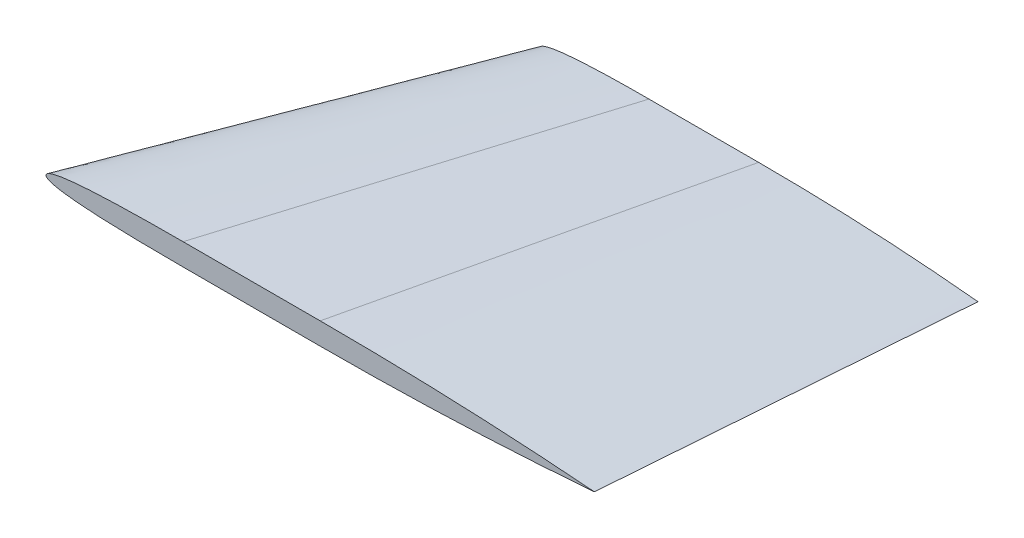
ISO-10303-21;
HEADER;
FILE_DESCRIPTION(('STEP AP214'),'2;1');
FILE_NAME('part.step','',(''),(''),'','','');
FILE_SCHEMA(('AUTOMOTIVE_DESIGN { 1 0 10303 214 1 1 1 1 }'));
ENDSEC;
DATA;
#1=APPLICATION_CONTEXT('core data for automotive mechanical design processes');
#2=APPLICATION_PROTOCOL_DEFINITION('international standard','automotive_design',2000,#1);
#3=PRODUCT_CONTEXT('',#1,'mechanical');
#4=PRODUCT('Part','Part','',(#3));
#5=PRODUCT_RELATED_PRODUCT_CATEGORY('part','',(#4));
#6=PRODUCT_DEFINITION_FORMATION('','',#4);
#7=PRODUCT_DEFINITION_CONTEXT('part definition',#1,'design');
#8=PRODUCT_DEFINITION('design','',#6,#7);
#9=PRODUCT_DEFINITION_SHAPE('','',#8);
#10=(LENGTH_UNIT() NAMED_UNIT(*) SI_UNIT(.MILLI.,.METRE.));
#11=(NAMED_UNIT(*) PLANE_ANGLE_UNIT() SI_UNIT($,.RADIAN.));
#12=(NAMED_UNIT(*) SI_UNIT($,.STERADIAN.) SOLID_ANGLE_UNIT());
#13=UNCERTAINTY_MEASURE_WITH_UNIT(LENGTH_MEASURE(1.E-05),#10,'distance_accuracy_value','');
#14=(GEOMETRIC_REPRESENTATION_CONTEXT(3) GLOBAL_UNCERTAINTY_ASSIGNED_CONTEXT((#13)) GLOBAL_UNIT_ASSIGNED_CONTEXT((#10,
#11,#12)) REPRESENTATION_CONTEXT('',''));
#15=CARTESIAN_POINT('',(0.,0.,0.));
#16=DIRECTION('',(0.,0.,1.));
#17=DIRECTION('',(1.,0.,0.));
#18=AXIS2_PLACEMENT_3D('',#15,#16,#17);
#19=CARTESIAN_POINT('',(0.,0.,0.));
#20=DIRECTION('',(0.,-1.,0.));
#21=DIRECTION('',(0.,0.,-1.));
#22=AXIS2_PLACEMENT_3D('',#19,#20,#21);
#23=PLANE('',#22);
#24=DIRECTION('',(-1.,0.,0.));
#25=VECTOR('',#24,1.);
#26=CARTESIAN_POINT('',(-33.3550389878657,0.,-28.8888888888889));
#27=LINE('',#26,#25);
#28=CARTESIAN_POINT('',(6.64496101213429,0.,-28.8888888888889));
#29=VERTEX_POINT('',#28);
#30=CARTESIAN_POINT('',(-13.3550389878657,0.,-28.8888888888889));
#31=VERTEX_POINT('',#30);
#32=EDGE_CURVE('E158',#29,#31,#27,.T.);
#33=ORIENTED_EDGE('',*,*,#32,.F.);
#34=DIRECTION('',(0.224164243499484,0.,-0.974551379833975));
#35=VECTOR('',#34,1.);
#36=CARTESIAN_POINT('',(-8.30620126516782,0.,36.1111111111111));
#37=LINE('',#36,#35);
#38=CARTESIAN_POINT('',(-8.30620126516782,0.,36.1111111111111));
#39=VERTEX_POINT('',#38);
#40=EDGE_CURVE('E236',#39,#29,#37,.T.);
#41=ORIENTED_EDGE('',*,*,#40,.F.);
#42=DIRECTION('',(1.,0.,0.));
#43=VECTOR('',#42,1.);
#44=CARTESIAN_POINT('',(-58.3062012651678,0.,36.1111111111111));
#45=LINE('',#44,#43);
#46=CARTESIAN_POINT('',(-33.3062012651678,0.,36.1111111111111));
#47=VERTEX_POINT('',#46);
#48=EDGE_CURVE('E213',#47,#39,#45,.T.);
#49=ORIENTED_EDGE('',*,*,#48,.F.);
#50=DIRECTION('',(0.293429624995853,0.,-0.955980677197397));
#51=VECTOR('',#50,1.);
#52=CARTESIAN_POINT('',(-23.3306201265168,0.,3.61111111111109));
#53=LINE('',#52,#51);
#54=EDGE_CURVE('E275',#47,#31,#53,.T.);
#55=ORIENTED_EDGE('',*,*,#54,.T.);
#56=EDGE_LOOP('',(#33,#41,#49,#55));
#57=FACE_BOUND('',#56,.T.);
#58=ADVANCED_FACE('F130',(#57),#23,.T.);
#59=CARTESIAN_POINT('',(0.,4.,0.));
#60=DIRECTION('',(0.,-1.,0.));
#61=DIRECTION('',(0.,0.,-1.));
#62=AXIS2_PLACEMENT_3D('',#59,#60,#61);
#63=PLANE('',#62);
#64=DIRECTION('',(1.,0.,0.));
#65=VECTOR('',#64,1.);
#66=CARTESIAN_POINT('',(-58.3062012651678,4.,36.1111111111111));
#67=LINE('',#66,#65);
#68=CARTESIAN_POINT('',(-33.3062012651678,4.,36.1111111111111));
#69=VERTEX_POINT('',#68);
#70=CARTESIAN_POINT('',(-8.30620126516782,4.,36.1111111111111));
#71=VERTEX_POINT('',#70);
#72=EDGE_CURVE('E142',#69,#71,#67,.T.);
#73=ORIENTED_EDGE('',*,*,#72,.T.);
#74=DIRECTION('',(0.224164243499484,0.,-0.974551379833975));
#75=VECTOR('',#74,1.);
#76=CARTESIAN_POINT('',(-0.830620126516762,4.,3.61111111111109));
#77=LINE('',#76,#75);
#78=CARTESIAN_POINT('',(6.64496101213429,4.,-28.8888888888889));
#79=VERTEX_POINT('',#78);
#80=EDGE_CURVE('E191',#71,#79,#77,.T.);
#81=ORIENTED_EDGE('',*,*,#80,.T.);
#82=DIRECTION('',(-1.,0.,0.));
#83=VECTOR('',#82,1.);
#84=CARTESIAN_POINT('',(-33.3550389878657,4.,-28.8888888888889));
#85=LINE('',#84,#83);
#86=CARTESIAN_POINT('',(-13.3550389878657,4.,-28.8888888888889));
#87=VERTEX_POINT('',#86);
#88=EDGE_CURVE('E211',#79,#87,#85,.T.);
#89=ORIENTED_EDGE('',*,*,#88,.T.);
#90=CARTESIAN_POINT('',(-33.3062012651678,4.,36.1111111111111));
#91=CARTESIAN_POINT('',(-26.6558138394004,4.,14.4444444444444));
#92=CARTESIAN_POINT('',(-20.0054264136331,4.,-7.22222222222225));
#93=CARTESIAN_POINT('',(-13.3550389878657,4.,-28.8888888888889));
#94=B_SPLINE_CURVE_WITH_KNOTS('',3,(#90,#91,#92,#93),.UNSPECIFIED.,.F.,.F.,(4,4),(0.,1.),.UNSPECIFIED.);
#95=EDGE_CURVE('E210',#69,#87,#94,.T.);
#96=ORIENTED_EDGE('',*,*,#95,.F.);
#97=EDGE_LOOP('',(#73,#81,#89,#96));
#98=FACE_BOUND('',#97,.T.);
#99=ADVANCED_FACE('F208',(#98),#63,.F.);
#100=CARTESIAN_POINT('',(-33.3550389878657,4.,-28.8888888888889));
#101=DIRECTION('',(0.,0.,1.));
#102=DIRECTION('',(1.,0.,0.));
#103=AXIS2_PLACEMENT_3D('',#100,#101,#102);
#104=PLANE('',#103);
#105=ORIENTED_EDGE('',*,*,#88,.F.);
#106=CARTESIAN_POINT('',(6.64496101213429,4.,-28.8888888888889));
#107=CARTESIAN_POINT('',(26.7075815989268,3.99999999999999,-28.8888888888889));
#108=CARTESIAN_POINT('',(46.6449610121343,2.,-28.8888888888889));
#109=B_SPLINE_CURVE_WITH_KNOTS('',2,(#106,#107,#108),.UNSPECIFIED.,.F.,.F.,(3,3),(0.,1.),.UNSPECIFIED.);
#110=CARTESIAN_POINT('',(46.6449610121343,2.,-28.8888888888889));
#111=VERTEX_POINT('',#110);
#112=EDGE_CURVE('E194',#79,#111,#109,.T.);
#113=ORIENTED_EDGE('',*,*,#112,.T.);
#114=CARTESIAN_POINT('',(6.64496101213429,0.,-28.8888888888889));
#115=CARTESIAN_POINT('',(26.7075815989268,0.,-28.8888888888889));
#116=CARTESIAN_POINT('',(46.6449610121343,2.,-28.8888888888889));
#117=B_SPLINE_CURVE_WITH_KNOTS('',2,(#114,#115,#116),.UNSPECIFIED.,.F.,.F.,(3,3),(0.,1.),.UNSPECIFIED.);
#118=EDGE_CURVE('E241',#29,#111,#117,.T.);
#119=ORIENTED_EDGE('',*,*,#118,.F.);
#120=ORIENTED_EDGE('',*,*,#32,.T.);
#121=CARTESIAN_POINT('',(-33.3550389878657,2.,-28.8888888888889));
#122=CARTESIAN_POINT('',(-33.4768817300547,-0.000156597654709864,-28.8888888888889));
#123=CARTESIAN_POINT('',(-13.3550389878657,0.,-28.8888888888889));
#124=B_SPLINE_CURVE_WITH_KNOTS('',2,(#121,#122,#123),.UNSPECIFIED.,.F.,.F.,(3,3),(0.,1.),.UNSPECIFIED.);
#125=CARTESIAN_POINT('',(-33.3550389878657,1.95213566414585,-28.8888888888889));
#126=VERTEX_POINT('',#125);
#127=EDGE_CURVE('E232',#126,#31,#124,.T.);
#128=ORIENTED_EDGE('',*,*,#127,.F.);
#129=DIRECTION('',(0.,-1.,0.));
#130=VECTOR('',#129,1.);
#131=CARTESIAN_POINT('',(-33.3550389878657,4.,-28.8888888888889));
#132=LINE('',#131,#130);
#133=CARTESIAN_POINT('',(-33.3550389878657,2.04786433585425,-28.8888888888889));
#134=VERTEX_POINT('',#133);
#135=EDGE_CURVE('E13',#134,#126,#132,.T.);
#136=ORIENTED_EDGE('',*,*,#135,.F.);
#137=CARTESIAN_POINT('',(-33.3550389878657,2.,-28.8888888888889));
#138=CARTESIAN_POINT('',(-33.4768817300547,4.00015659765471,-28.8888888888889));
#139=CARTESIAN_POINT('',(-13.3550389878657,4.,-28.8888888888889));
#140=B_SPLINE_CURVE_WITH_KNOTS('',2,(#137,#138,#139),.UNSPECIFIED.,.F.,.F.,(3,3),(0.,1.),.UNSPECIFIED.);
#141=EDGE_CURVE('E231',#134,#87,#140,.T.);
#142=ORIENTED_EDGE('',*,*,#141,.T.);
#143=EDGE_LOOP('',(#105,#113,#119,#120,#128,#136,#142));
#144=FACE_BOUND('',#143,.T.);
#145=ADVANCED_FACE('F132',(#144),#104,.F.);
#146=CARTESIAN_POINT('',(-58.3062012651678,4.,36.1111111111111));
#147=DIRECTION('',(0.933580426497201,0.,0.358367949545301));
#148=DIRECTION('',(0.358367949545301,0.,-0.933580426497201));
#149=AXIS2_PLACEMENT_3D('',#146,#147,#148);
#150=PLANE('',#149);
#151=ORIENTED_EDGE('',*,*,#135,.T.);
#152=DIRECTION('',(0.358367864861597,-0.000687464561868342,-0.933580205888608));
#153=VECTOR('',#152,1.);
#154=CARTESIAN_POINT('',(-58.3062012651678,2.,36.1111111111111));
#155=LINE('',#154,#153);
#156=CARTESIAN_POINT('',(-58.3057212466994,2.00600220058824,36.1111111111111));
#157=VERTEX_POINT('',#156);
#158=EDGE_CURVE('E278',#157,#126,#155,.T.);
#159=ORIENTED_EDGE('',*,*,#158,.F.);
#160=CARTESIAN_POINT('',(-58.3062012651678,2.,36.1111111111111));
#161=CARTESIAN_POINT('',(-49.9891471727338,2.01595477861808,14.4444444444444));
#162=CARTESIAN_POINT('',(-41.6720930802997,2.03190955723617,-7.22222222222225));
#163=CARTESIAN_POINT('',(-33.3550389878657,2.04786433585425,-28.8888888888889));
#164=B_SPLINE_CURVE_WITH_KNOTS('',3,(#160,#161,#162,#163),.UNSPECIFIED.,.F.,.F.,(4,4),(0.,1.),.UNSPECIFIED.);
#165=EDGE_CURVE('E380',#157,#134,#164,.T.);
#166=ORIENTED_EDGE('',*,*,#165,.T.);
#167=EDGE_LOOP('',(#151,#159,#166));
#168=FACE_BOUND('',#167,.T.);
#169=ADVANCED_FACE('F361',(#168),#150,.F.);
#170=CARTESIAN_POINT('',(-58.3062012651678,4.,36.1111111111111));
#171=DIRECTION('',(0.,0.,-1.));
#172=DIRECTION('',(-1.,0.,0.));
#173=AXIS2_PLACEMENT_3D('',#170,#171,#172);
#174=PLANE('',#173);
#175=CARTESIAN_POINT('',(-8.30620126516782,0.,36.1111111111111));
#176=CARTESIAN_POINT('',(16.7498473667231,0.,36.1111111111111));
#177=CARTESIAN_POINT('',(41.6937987348322,2.,36.1111111111111));
#178=B_SPLINE_CURVE_WITH_KNOTS('',2,(#175,#176,#177),.UNSPECIFIED.,.F.,.F.,(3,3),(0.,1.),.UNSPECIFIED.);
#179=CARTESIAN_POINT('',(41.6937987348322,2.,36.1111111111111));
#180=VERTEX_POINT('',#179);
#181=EDGE_CURVE('E205',#39,#180,#178,.T.);
#182=ORIENTED_EDGE('',*,*,#181,.T.);
#183=CARTESIAN_POINT('',(-8.30620126516782,4.,36.1111111111111));
#184=CARTESIAN_POINT('',(16.749847366723,4.,36.1111111111111));
#185=CARTESIAN_POINT('',(41.6937987348322,2.,36.1111111111111));
#186=B_SPLINE_CURVE_WITH_KNOTS('',2,(#183,#184,#185),.UNSPECIFIED.,.F.,.F.,(3,3),(0.,1.),.UNSPECIFIED.);
#187=EDGE_CURVE('E150',#71,#180,#186,.T.);
#188=ORIENTED_EDGE('',*,*,#187,.F.);
#189=ORIENTED_EDGE('',*,*,#72,.F.);
#190=CARTESIAN_POINT('',(-58.3062012651678,2.,36.1111111111111));
#191=CARTESIAN_POINT('',(-58.2981682863197,2.13185803387447,36.1111111111111));
#192=CARTESIAN_POINT('',(-58.1165495380854,2.3512782454784,36.1111111111111));
#193=CARTESIAN_POINT('',(-57.6523540562812,2.59937777239834,36.1111111111111));
#194=CARTESIAN_POINT('',(-57.0197515682006,2.80617439716223,36.111111111111));
#195=CARTESIAN_POINT('',(-56.3769150244662,2.95010416964718,36.1111111111111));
#196=CARTESIAN_POINT('',(-55.8568799760318,3.04843051159478,36.1111111111111));
#197=CARTESIAN_POINT('',(-55.3359662965872,3.13504754543367,36.1111111111111));
#198=CARTESIAN_POINT('',(-54.6818489795878,3.2286430482675,36.1111111111111));
#199=CARTESIAN_POINT('',(-53.6326085869534,3.35434667278868,36.111111111111));
#200=CARTESIAN_POINT('',(-52.3173026060738,3.47915567883608,36.1111111111111));
#201=CARTESIAN_POINT('',(-50.736341932929,3.59550791665806,36.1111111111111));
#202=CARTESIAN_POINT('',(-49.1537633268491,3.68800069592947,36.1111111111111));
#203=CARTESIAN_POINT('',(-47.5702823950901,3.76243746410943,36.1111111111111));
#204=CARTESIAN_POINT('',(-45.9861816087334,3.82258876530267,36.1111111111111));
#205=CARTESIAN_POINT('',(-44.4016961914234,3.87109571460881,36.111111111111));
#206=CARTESIAN_POINT('',(-42.8169399486991,3.90986090614081,36.1111111111111));
#207=CARTESIAN_POINT('',(-41.2320059940613,3.94034760640304,36.1111111111111));
#208=CARTESIAN_POINT('',(-39.1186009927976,3.97140917344184,36.1111111111111));
#209=CARTESIAN_POINT('',(-36.4766432024574,3.99460959973483,36.1111111111111));
#210=CARTESIAN_POINT('',(-34.3630212451883,4.,36.1111111111111));
#211=CARTESIAN_POINT('',(-33.3062012651678,4.,36.1111111111111));
#212=B_SPLINE_CURVE_WITH_KNOTS('',3,(#190,#191,#192,#193,#194,#195,#196,#197,#198,#199,#200,
#201,#202,#203,#204,#205,#206,#207,#208,#209,#210,#211),.UNSPECIFIED.,.F.,.F.,(4,1,1,1,1,1,1,1,
1,1,1,1,1,1,1,1,1,1,1,4),(0.474821972073358,0.48236939656901,0.489916821064662,
0.505011670055968,0.520106519047273,0.527653943542926,0.535201368038578,0.550296217029883,
0.565391066021188,0.595580764003799,0.625770461986409,0.655960159969019,0.68614985795163,
0.71633955593424,0.74652925391685,0.776718951899461,0.806908649882071,0.837098347864681,
0.897477743829902,0.957857139795123),.UNSPECIFIED.);
#213=EDGE_CURVE('E417',#157,#69,#212,.T.);
#214=ORIENTED_EDGE('',*,*,#213,.F.);
#215=CARTESIAN_POINT('',(-58.3062012651678,2.,36.1111111111111));
#216=CARTESIAN_POINT('',(-58.1843584223458,0.,36.1111111111111));
#217=CARTESIAN_POINT('',(-33.3062012651678,0.,36.1111111111111));
#218=B_SPLINE_CURVE_WITH_KNOTS('',2,(#215,#216,#217),.UNSPECIFIED.,.F.,.F.,(3,3),(0.,1.),.UNSPECIFIED.);
#219=EDGE_CURVE('E247',#157,#47,#218,.T.);
#220=ORIENTED_EDGE('',*,*,#219,.T.);
#221=ORIENTED_EDGE('',*,*,#48,.T.);
#222=EDGE_LOOP('',(#182,#188,#189,#214,#220,#221));
#223=FACE_BOUND('',#222,.T.);
#224=ADVANCED_FACE('F202',(#223),#174,.F.);
#225=CARTESIAN_POINT('',(-33.3062012651678,4.,36.1111111111111));
#226=CARTESIAN_POINT('',(-26.6558138394004,4.,14.4444444444444));
#227=CARTESIAN_POINT('',(-20.0054264136331,4.,-7.22222222222225));
#228=CARTESIAN_POINT('',(-13.3550389878657,4.,-28.8888888888889));
#229=CARTESIAN_POINT('',(-34.3630212451883,4.,36.1111111111111));
#230=CARTESIAN_POINT('',(-27.6437050924178,4.00000220512109,14.4444444444444));
#231=CARTESIAN_POINT('',(-20.9243889396473,4.00000441024218,-7.22222222222225));
#232=CARTESIAN_POINT('',(-14.2050727868767,4.00000661536327,-28.8888888888889));
#233=CARTESIAN_POINT('',(-36.4766432024574,3.99460959973483,36.1111111111111));
#234=CARTESIAN_POINT('',(-29.6194695161449,3.99463775263086,14.4444444444444));
#235=CARTESIAN_POINT('',(-22.7622958298324,3.99466590552689,-7.22222222222229));
#236=CARTESIAN_POINT('',(-15.9051221435198,3.99469405842292,-28.888888888889));
#237=CARTESIAN_POINT('',(-39.1186009927976,3.97140917344184,36.1111111111111));
#238=CARTESIAN_POINT('',(-32.089098820084,3.97151779060535,14.4444444444444));
#239=CARTESIAN_POINT('',(-25.0595966473703,3.97162640776887,-7.22222222222222));
#240=CARTESIAN_POINT('',(-18.0300944746567,3.97173502493238,-28.8888888888889));
#241=CARTESIAN_POINT('',(-41.2320059940613,3.94034760640304,36.1111111111111));
#242=CARTESIAN_POINT('',(-34.0646305759387,3.94056543392277,14.4444444444444));
#243=CARTESIAN_POINT('',(-26.897255157816,3.94078326144251,-7.22222222222226));
#244=CARTESIAN_POINT('',(-19.7298797396933,3.94100108896224,-28.8888888888889));
#245=CARTESIAN_POINT('',(-42.8169399486991,3.90986090614081,36.1111111111111));
#246=CARTESIAN_POINT('',(-35.5461489412502,3.91016607124094,14.4444444444444));
#247=CARTESIAN_POINT('',(-28.2753579338012,3.91047123634108,-7.22222222222225));
#248=CARTESIAN_POINT('',(-21.0045669263523,3.91077640144122,-28.8888888888889));
#249=CARTESIAN_POINT('',(-44.4016961914234,3.87109571460881,36.111111111111));
#250=CARTESIAN_POINT('',(-37.0274797571859,3.87152600887994,14.4444444444444));
#251=CARTESIAN_POINT('',(-29.6532633229484,3.87195630315108,-7.22222222222225));
#252=CARTESIAN_POINT('',(-22.2790468887108,3.87238659742221,-28.8888888888889));
#253=CARTESIAN_POINT('',(-45.9861816087334,3.82258876530267,36.1111111111111));
#254=CARTESIAN_POINT('',(-38.5085131135605,3.8231342906061,14.4444444444445));
#255=CARTESIAN_POINT('',(-31.0308446183875,3.82367981590953,-7.22222222222224));
#256=CARTESIAN_POINT('',(-23.5531761232145,3.82422534121296,-28.8888888888889));
#257=CARTESIAN_POINT('',(-47.5702823950901,3.76243746410943,36.1111111111111));
#258=CARTESIAN_POINT('',(-39.9891437491009,3.7631572417232,14.4444444444444));
#259=CARTESIAN_POINT('',(-32.4080051031118,3.76387701933697,-7.22222222222224));
#260=CARTESIAN_POINT('',(-24.8268664571226,3.76459679695074,-28.8888888888889));
#261=CARTESIAN_POINT('',(-49.1537633268491,3.68800069592947,36.1111111111111));
#262=CARTESIAN_POINT('',(-41.4690859581669,3.68883193031736,14.4444444444444));
#263=CARTESIAN_POINT('',(-33.7844085894847,3.68966316470525,-7.22222222222226));
#264=CARTESIAN_POINT('',(-26.0997312208026,3.69049439909314,-28.888888888889));
#265=CARTESIAN_POINT('',(-50.736341932929,3.59550791665806,36.1111111111111));
#266=CARTESIAN_POINT('',(-42.9480945432847,3.59659226203683,14.4444444444444));
#267=CARTESIAN_POINT('',(-35.1598471536404,3.59767660741561,-7.22222222222222));
#268=CARTESIAN_POINT('',(-27.3715997639962,3.59876095279438,-28.8888888888889));
#269=CARTESIAN_POINT('',(-52.3173026060738,3.47915567883608,36.1111111111111));
#270=CARTESIAN_POINT('',(-44.4252767009301,3.48020530084008,14.4444444444444));
#271=CARTESIAN_POINT('',(-36.5332507957864,3.48125492284408,-7.22222222222225));
#272=CARTESIAN_POINT('',(-28.6412248906427,3.48230454484808,-28.8888888888889));
#273=CARTESIAN_POINT('',(-53.6326085869534,3.35434667278868,36.111111111111));
#274=CARTESIAN_POINT('',(-45.6540402137099,3.35574828371843,14.4444444444444));
#275=CARTESIAN_POINT('',(-37.6754718404665,3.35714989464818,-7.22222222222227));
#276=CARTESIAN_POINT('',(-29.696903467223,3.35855150557793,-28.8888888888889));
#277=CARTESIAN_POINT('',(-54.6818489795878,3.2286430482675,36.1111111111111));
#278=CARTESIAN_POINT('',(-46.6336881152799,3.22976733915845,14.4444444444445));
#279=CARTESIAN_POINT('',(-38.585527250972,3.2308916300494,-7.22222222222223));
#280=CARTESIAN_POINT('',(-30.5373663866641,3.23201592094035,-28.8888888888889));
#281=CARTESIAN_POINT('',(-55.3359662965872,3.13504754543367,36.1111111111111));
#282=CARTESIAN_POINT('',(-47.2440557080312,3.13601287809875,14.4444444444444));
#283=CARTESIAN_POINT('',(-39.1521451194752,3.13697821076383,-7.22222222222225));
#284=CARTESIAN_POINT('',(-31.0602345309192,3.1379435434289,-28.8888888888889));
#285=CARTESIAN_POINT('',(-55.8568799760318,3.04843051159478,36.1111111111111));
#286=CARTESIAN_POINT('',(-47.730134522456,3.04948159612638,14.4444444444444));
#287=CARTESIAN_POINT('',(-39.6033890688803,3.05053268065798,-7.22222222222224));
#288=CARTESIAN_POINT('',(-31.4766436153046,3.05158376518958,-28.8888888888889));
#289=CARTESIAN_POINT('',(-56.3769150244662,2.95010416964718,36.1111111111111));
#290=CARTESIAN_POINT('',(-48.2147587346793,2.9514713601396,14.4444444444444));
#291=CARTESIAN_POINT('',(-40.0526024448925,2.95283855063201,-7.22222222222225));
#292=CARTESIAN_POINT('',(-31.8904461551057,2.95420574112442,-28.8888888888889));
#293=CARTESIAN_POINT('',(-57.0197515682006,2.80617439716223,36.111111111111));
#294=CARTESIAN_POINT('',(-48.813261570947,2.80579697626944,14.4444444444444));
#295=CARTESIAN_POINT('',(-40.6067715736933,2.80541955537664,-7.22222222222228));
#296=CARTESIAN_POINT('',(-32.4002815764396,2.80504213448384,-28.8888888888889));
#297=CARTESIAN_POINT('',(-57.6523540562812,2.59937777239834,36.1111111111111));
#298=CARTESIAN_POINT('',(-49.3993956065292,2.59998699851085,14.4444444444444));
#299=CARTESIAN_POINT('',(-41.1464371567771,2.60059622462336,-7.22222222222223));
#300=CARTESIAN_POINT('',(-32.8934787070251,2.60120545073587,-28.8888888888889));
#301=CARTESIAN_POINT('',(-58.1165495380854,2.3512782454784,36.1111111111111));
#302=CARTESIAN_POINT('',(-49.824409364931,2.35063249142876,14.4444444444444));
#303=CARTESIAN_POINT('',(-41.5322691917765,2.34998673737913,-7.22222222222223));
#304=CARTESIAN_POINT('',(-33.240129018622,2.34934098332949,-28.8888888888889));
#305=CARTESIAN_POINT('',(-58.2981682863197,2.13185803387447,36.1111111111111));
#306=CARTESIAN_POINT('',(-49.9816121539776,2.13921107432172,14.4444444444444));
#307=CARTESIAN_POINT('',(-41.6650560216354,2.14656411476897,-7.22222222222225));
#308=CARTESIAN_POINT('',(-33.3484998892933,2.15391715521622,-28.8888888888889));
#309=CARTESIAN_POINT('',(-58.3062012651678,2.,36.1111111111111));
#310=CARTESIAN_POINT('',(-49.9891471727338,2.01595477861808,14.4444444444444));
#311=CARTESIAN_POINT('',(-41.6720930802997,2.03190955723617,-7.22222222222225));
#312=CARTESIAN_POINT('',(-33.3550389878657,2.04786433585425,-28.8888888888889));
#313=B_SPLINE_SURFACE_WITH_KNOTS('',3,3,((#225,#226,#227,#228),(#229,#230,#231,#232),(#233,#234,
#235,#236),(#237,#238,#239,#240),(#241,#242,#243,#244),(#245,#246,#247,#248),(#249,#250,#251,
#252),(#253,#254,#255,#256),(#257,#258,#259,#260),(#261,#262,#263,#264),(#265,#266,#267,#268),
(#269,#270,#271,#272),(#273,#274,#275,#276),(#277,#278,#279,#280),(#281,#282,#283,#284),(#285,
#286,#287,#288),(#289,#290,#291,#292),(#293,#294,#295,#296),(#297,#298,#299,#300),(#301,#302,
#303,#304),(#305,#306,#307,#308),(#309,#310,#311,#312)),.UNSPECIFIED.,.F.,.F.,.F.,(4,1,1,1,1,1,
1,1,1,1,1,1,1,1,1,1,1,1,1,4),(4,4),(0.474821972073358,0.535201368038578,0.595580764003799,
0.625770461986409,0.655960159969019,0.68614985795163,0.71633955593424,0.74652925391685,
0.776718951899461,0.806908649882071,0.837098347864682,0.867288045847292,0.882382894838597,
0.897477743829902,0.905025168325555,0.912572592821207,0.927667441812512,0.942762290803818,
0.95030971529947,0.957857139795123),(0.,1.),.UNSPECIFIED.);
#314=ORIENTED_EDGE('',*,*,#213,.T.);
#315=ORIENTED_EDGE('',*,*,#95,.T.);
#316=ORIENTED_EDGE('',*,*,#141,.F.);
#317=ORIENTED_EDGE('',*,*,#165,.F.);
#318=EDGE_LOOP('',(#314,#315,#316,#317));
#319=FACE_BOUND('',#318,.T.);
#320=ADVANCED_FACE('F305',(#319),#313,.F.);
#321=CARTESIAN_POINT('',(-58.3062012651678,2.,36.1111111111111));
#322=CARTESIAN_POINT('',(-33.3550389878654,1.95213566414587,-28.8888888888889));
#323=CARTESIAN_POINT('',(-58.2994891594274,1.88982355327673,36.1111111111111));
#324=CARTESIAN_POINT('',(-33.3495781430853,1.86357024818754,-28.8888888888889));
#325=CARTESIAN_POINT('',(-58.1797118547914,1.71483026010469,36.1111111111111));
#326=CARTESIAN_POINT('',(-33.2853467954152,1.72156531285855,-28.8888888888889));
#327=CARTESIAN_POINT('',(-57.9915085825288,1.58771297143912,36.111111111111));
#328=CARTESIAN_POINT('',(-33.1498888354562,1.59383966696533,-28.888888888889));
#329=CARTESIAN_POINT('',(-57.6871737102998,1.41706478927899,36.1111111111109));
#330=CARTESIAN_POINT('',(-32.9191140279181,1.42076447327975,-28.888888888889));
#331=CARTESIAN_POINT('',(-57.4087532189502,1.31941788385268,36.111111111111));
#332=CARTESIAN_POINT('',(-32.704143645918,1.31935502238824,-28.8888888888889));
#333=CARTESIAN_POINT('',(-56.8224731841386,1.14724420391475,36.1111111111111));
#334=CARTESIAN_POINT('',(-32.2438357694062,1.14580593328467,-28.8888888888889));
#335=CARTESIAN_POINT('',(-56.4174029453951,1.05805299677177,36.1111111111112));
#336=CARTESIAN_POINT('',(-31.9226136137301,1.0553587464075,-28.8888888888889));
#337=CARTESIAN_POINT('',(-55.413917327172,0.868394201503319,36.1111111111113));
#338=CARTESIAN_POINT('',(-31.1233651318233,0.865228030993127,-28.888888888889));
#339=CARTESIAN_POINT('',(-54.7024860485952,0.771713981849287,36.1111111111111));
#340=CARTESIAN_POINT('',(-30.5541063775974,0.767824890997308,-28.8888888888889));
#341=CARTESIAN_POINT('',(-53.4089296733141,0.62424270678325,36.1111111111111));
#342=CARTESIAN_POINT('',(-29.5172974225408,0.620511658809497,-28.8888888888888));
#343=CARTESIAN_POINT('',(-52.7143661358188,0.559394453392354,36.1111111111111));
#344=CARTESIAN_POINT('',(-28.9599300336634,0.555742542606767,-28.8888888888889));
#345=CARTESIAN_POINT('',(-50.403233054827,0.370972220816656,36.1111111111111));
#346=CARTESIAN_POINT('',(-27.1042956215246,0.368189072122527,-28.888888888889));
#347=CARTESIAN_POINT('',(-48.6800516201006,0.2821612885409,36.1111111111111));
#348=CARTESIAN_POINT('',(-25.7191507911181,0.279702245265192,-28.888888888889));
#349=CARTESIAN_POINT('',(-42.4428319514685,0.0348267109092653,36.1111111111111));
#350=CARTESIAN_POINT('',(-20.7043317144599,0.0344574407726232,-28.888888888889));
#351=CARTESIAN_POINT('',(-37.8597794710717,0.,36.1111111111111));
#352=CARTESIAN_POINT('',(-17.0176267331655,-2.85039823854423E-05,-28.8888888888889));
#353=CARTESIAN_POINT('',(-33.3062012651678,0.,36.1111111111111));
#354=CARTESIAN_POINT('',(-13.3550389878657,0.,-28.8888888888889));
#355=B_SPLINE_SURFACE_WITH_KNOTS('',3,1,((#321,#322),(#323,#324),(#325,#326),(#327,#328),(#329,
#330),(#331,#332),(#333,#334),(#335,#336),(#337,#338),(#339,#340),(#341,#342),(#343,#344),(#345,
#346),(#347,#348),(#349,#350),(#351,#352),(#353,#354)),.UNSPECIFIED.,.F.,.F.,.F.,(4,1,1,1,1,1,1,
1,1,1,1,1,1,1,4),(2,2),(0.,0.0130335558260233,0.0236646502785041,0.0266955686063861,
0.0543505595370665,0.0583998105935825,0.0988700618423397,0.103365340270874,0.179200697813376,
0.18376572265506,0.257356535356877,0.261699707252356,0.458038546790629,0.461404466887766,1.),
(0.,1.),.UNSPECIFIED.);
#356=ORIENTED_EDGE('',*,*,#219,.F.);
#357=ORIENTED_EDGE('',*,*,#158,.T.);
#358=ORIENTED_EDGE('',*,*,#127,.T.);
#359=ORIENTED_EDGE('',*,*,#54,.F.);
#360=EDGE_LOOP('',(#356,#357,#358,#359));
#361=FACE_BOUND('',#360,.T.);
#362=ADVANCED_FACE('F293',(#361),#355,.F.);
#363=CARTESIAN_POINT('',(-8.30620126516782,0.,36.1111111111111));
#364=CARTESIAN_POINT('',(6.64496101213429,0.,-28.8888888888889));
#365=CARTESIAN_POINT('',(16.7498473667231,0.,36.1111111111111));
#366=CARTESIAN_POINT('',(26.7075815989268,0.,-28.8888888888889));
#367=CARTESIAN_POINT('',(41.6937987348322,2.,36.1111111111111));
#368=CARTESIAN_POINT('',(46.6449610121343,2.,-28.8888888888889));
#369=B_SPLINE_SURFACE_WITH_KNOTS('',2,1,((#363,#364),(#365,#366),(#367,#368)),.UNSPECIFIED.,.F.,
.F.,.F.,(3,3),(2,2),(0.,1.),(0.,1.),.UNSPECIFIED.);
#370=DIRECTION('',(0.0759517051198801,0.,-0.997111497521407));
#371=VECTOR('',#370,1.);
#372=CARTESIAN_POINT('',(44.1693798734832,2.,3.61111111111109));
#373=LINE('',#372,#371);
#374=EDGE_CURVE('E248',#180,#111,#373,.T.);
#375=ORIENTED_EDGE('',*,*,#181,.F.);
#376=ORIENTED_EDGE('',*,*,#40,.T.);
#377=ORIENTED_EDGE('',*,*,#118,.T.);
#378=ORIENTED_EDGE('',*,*,#374,.F.);
#379=EDGE_LOOP('',(#375,#376,#377,#378));
#380=FACE_BOUND('',#379,.T.);
#381=ADVANCED_FACE('F264',(#380),#369,.F.);
#382=CARTESIAN_POINT('',(41.6937987348322,2.,36.1111111111111));
#383=CARTESIAN_POINT('',(46.6449610121343,2.,-28.8888888888889));
#384=CARTESIAN_POINT('',(16.749847366723,4.,36.1111111111111));
#385=CARTESIAN_POINT('',(26.7075815989268,3.99999999999999,-28.8888888888889));
#386=CARTESIAN_POINT('',(-8.30620126516782,4.,36.1111111111111));
#387=CARTESIAN_POINT('',(6.64496101213429,4.,-28.8888888888889));
#388=B_SPLINE_SURFACE_WITH_KNOTS('',2,1,((#382,#383),(#384,#385),(#386,#387)),.UNSPECIFIED.,.F.,
.F.,.F.,(3,3),(2,2),(0.,1.),(0.,1.),.UNSPECIFIED.);
#389=ORIENTED_EDGE('',*,*,#187,.T.);
#390=ORIENTED_EDGE('',*,*,#374,.T.);
#391=ORIENTED_EDGE('',*,*,#112,.F.);
#392=ORIENTED_EDGE('',*,*,#80,.F.);
#393=EDGE_LOOP('',(#389,#390,#391,#392));
#394=FACE_BOUND('',#393,.T.);
#395=ADVANCED_FACE('F192',(#394),#388,.F.);
#396=CLOSED_SHELL('',(#58,#99,#145,#169,#224,#320,#362,#381,#395));
#397=MANIFOLD_SOLID_BREP('B2',#396);
#398=ADVANCED_BREP_SHAPE_REPRESENTATION('',(#18,#397),#14);
#399=SHAPE_DEFINITION_REPRESENTATION(#9,#398);
ENDSEC;
END-ISO-10303-21;
